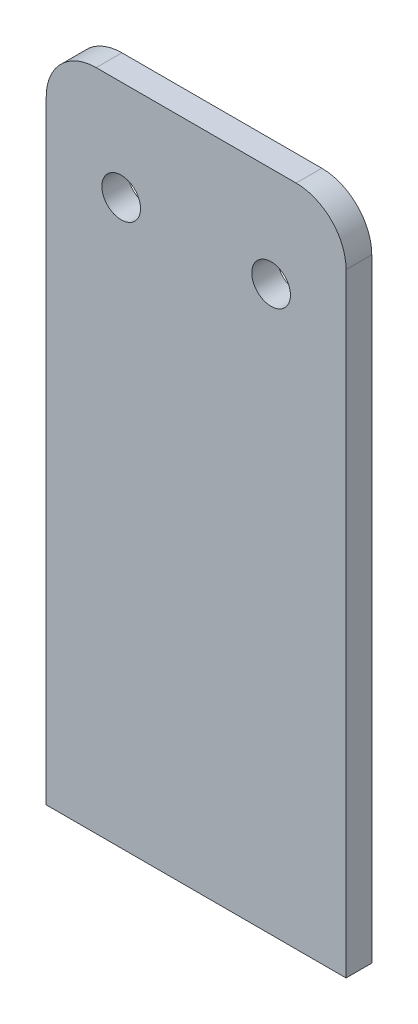
ISO-10303-21;
HEADER;
FILE_DESCRIPTION(('STEP AP214'),'2;1');
FILE_NAME('part.step','',(''),(''),'','','');
FILE_SCHEMA(('AUTOMOTIVE_DESIGN { 1 0 10303 214 1 1 1 1 }'));
ENDSEC;
DATA;
#1=APPLICATION_CONTEXT('core data for automotive mechanical design processes');
#2=APPLICATION_PROTOCOL_DEFINITION('international standard','automotive_design',2000,#1);
#3=PRODUCT_CONTEXT('',#1,'mechanical');
#4=PRODUCT('Part','Part','',(#3));
#5=PRODUCT_RELATED_PRODUCT_CATEGORY('part','',(#4));
#6=PRODUCT_DEFINITION_FORMATION('','',#4);
#7=PRODUCT_DEFINITION_CONTEXT('part definition',#1,'design');
#8=PRODUCT_DEFINITION('design','',#6,#7);
#9=PRODUCT_DEFINITION_SHAPE('','',#8);
#10=(LENGTH_UNIT() NAMED_UNIT(*) SI_UNIT(.MILLI.,.METRE.));
#11=(NAMED_UNIT(*) PLANE_ANGLE_UNIT() SI_UNIT($,.RADIAN.));
#12=(NAMED_UNIT(*) SI_UNIT($,.STERADIAN.) SOLID_ANGLE_UNIT());
#13=UNCERTAINTY_MEASURE_WITH_UNIT(LENGTH_MEASURE(1.E-05),#10,'distance_accuracy_value','');
#14=(GEOMETRIC_REPRESENTATION_CONTEXT(3) GLOBAL_UNCERTAINTY_ASSIGNED_CONTEXT((#13)) GLOBAL_UNIT_ASSIGNED_CONTEXT((#10,
#11,#12)) REPRESENTATION_CONTEXT('',''));
#15=CARTESIAN_POINT('',(0.,0.,0.));
#16=DIRECTION('',(0.,0.,1.));
#17=DIRECTION('',(1.,0.,0.));
#18=AXIS2_PLACEMENT_3D('',#15,#16,#17);
#19=CARTESIAN_POINT('',(19.05,-42.154475,-3.2639));
#20=DIRECTION('',(1.,0.,0.));
#21=DIRECTION('',(0.,0.,-1.));
#22=AXIS2_PLACEMENT_3D('',#19,#20,#21);
#23=PLANE('',#22);
#24=DIRECTION('',(0.,1.,0.));
#25=VECTOR('',#24,1.);
#26=CARTESIAN_POINT('',(19.05,-42.154475,-3.2639));
#27=LINE('',#26,#25);
#28=CARTESIAN_POINT('',(19.05,-42.154475,-3.2639));
#29=VERTEX_POINT('',#28);
#30=CARTESIAN_POINT('',(19.05,35.804475,-3.2639));
#31=VERTEX_POINT('',#30);
#32=EDGE_CURVE('E111',#29,#31,#27,.T.);
#33=ORIENTED_EDGE('',*,*,#32,.T.);
#34=DIRECTION('',(0.,0.,1.));
#35=VECTOR('',#34,1.);
#36=CARTESIAN_POINT('',(19.05,35.804475,-3.2639));
#37=LINE('',#36,#35);
#38=CARTESIAN_POINT('',(19.05,35.804475,0.));
#39=VERTEX_POINT('',#38);
#40=EDGE_CURVE('E11',#31,#39,#37,.T.);
#41=ORIENTED_EDGE('',*,*,#40,.T.);
#42=DIRECTION('',(0.,1.,0.));
#43=VECTOR('',#42,1.);
#44=CARTESIAN_POINT('',(19.05,-42.154475,0.));
#45=LINE('',#44,#43);
#46=CARTESIAN_POINT('',(19.05,-42.154475,0.));
#47=VERTEX_POINT('',#46);
#48=EDGE_CURVE('E115',#47,#39,#45,.T.);
#49=ORIENTED_EDGE('',*,*,#48,.F.);
#50=DIRECTION('',(0.,0.,1.));
#51=VECTOR('',#50,1.);
#52=CARTESIAN_POINT('',(19.05,-42.154475,-3.2639));
#53=LINE('',#52,#51);
#54=EDGE_CURVE('E108',#29,#47,#53,.T.);
#55=ORIENTED_EDGE('',*,*,#54,.F.);
#56=EDGE_LOOP('',(#33,#41,#49,#55));
#57=FACE_BOUND('',#56,.T.);
#58=ADVANCED_FACE('F39',(#57),#23,.T.);
#59=CARTESIAN_POINT('',(-19.05,-42.154475,-3.2639));
#60=DIRECTION('',(0.,-1.,0.));
#61=DIRECTION('',(0.,0.,-1.));
#62=AXIS2_PLACEMENT_3D('',#59,#60,#61);
#63=PLANE('',#62);
#64=DIRECTION('',(1.,0.,0.));
#65=VECTOR('',#64,1.);
#66=CARTESIAN_POINT('',(-19.05,-42.154475,0.));
#67=LINE('',#66,#65);
#68=CARTESIAN_POINT('',(-19.05,-42.154475,0.));
#69=VERTEX_POINT('',#68);
#70=EDGE_CURVE('E107',#69,#47,#67,.T.);
#71=ORIENTED_EDGE('',*,*,#70,.F.);
#72=DIRECTION('',(0.,0.,1.));
#73=VECTOR('',#72,1.);
#74=CARTESIAN_POINT('',(-19.05,-42.154475,-3.2639));
#75=LINE('',#74,#73);
#76=CARTESIAN_POINT('',(-19.05,-42.154475,-3.2639));
#77=VERTEX_POINT('',#76);
#78=EDGE_CURVE('E96',#77,#69,#75,.T.);
#79=ORIENTED_EDGE('',*,*,#78,.F.);
#80=DIRECTION('',(1.,0.,0.));
#81=VECTOR('',#80,1.);
#82=CARTESIAN_POINT('',(-19.05,-42.154475,-3.2639));
#83=LINE('',#82,#81);
#84=EDGE_CURVE('E100',#77,#29,#83,.T.);
#85=ORIENTED_EDGE('',*,*,#84,.T.);
#86=ORIENTED_EDGE('',*,*,#54,.T.);
#87=EDGE_LOOP('',(#71,#79,#85,#86));
#88=FACE_BOUND('',#87,.T.);
#89=ADVANCED_FACE('F105',(#88),#63,.T.);
#90=CARTESIAN_POINT('',(-19.05,-42.154475,-3.2639));
#91=DIRECTION('',(-1.,0.,0.));
#92=DIRECTION('',(0.,0.,1.));
#93=AXIS2_PLACEMENT_3D('',#90,#91,#92);
#94=PLANE('',#93);
#95=DIRECTION('',(0.,-1.,0.));
#96=VECTOR('',#95,1.);
#97=CARTESIAN_POINT('',(-19.05,-42.154475,0.));
#98=LINE('',#97,#96);
#99=CARTESIAN_POINT('',(-19.05,35.804475,0.));
#100=VERTEX_POINT('',#99);
#101=EDGE_CURVE('E122',#100,#69,#98,.T.);
#102=ORIENTED_EDGE('',*,*,#101,.F.);
#103=DIRECTION('',(0.,0.,1.));
#104=VECTOR('',#103,1.);
#105=CARTESIAN_POINT('',(-19.05,35.804475,-3.2639));
#106=LINE('',#105,#104);
#107=CARTESIAN_POINT('',(-19.05,35.804475,-3.2639));
#108=VERTEX_POINT('',#107);
#109=EDGE_CURVE('E62',#100,#108,#106,.F.);
#110=ORIENTED_EDGE('',*,*,#109,.T.);
#111=DIRECTION('',(0.,-1.,0.));
#112=VECTOR('',#111,1.);
#113=CARTESIAN_POINT('',(-19.05,-42.154475,-3.2639));
#114=LINE('',#113,#112);
#115=EDGE_CURVE('E93',#108,#77,#114,.T.);
#116=ORIENTED_EDGE('',*,*,#115,.T.);
#117=ORIENTED_EDGE('',*,*,#78,.T.);
#118=EDGE_LOOP('',(#102,#110,#116,#117));
#119=FACE_BOUND('',#118,.T.);
#120=ADVANCED_FACE('F95',(#119),#94,.T.);
#121=CARTESIAN_POINT('',(-19.05,42.154475,-3.2639));
#122=DIRECTION('',(0.,1.,0.));
#123=DIRECTION('',(0.,0.,1.));
#124=AXIS2_PLACEMENT_3D('',#121,#122,#123);
#125=PLANE('',#124);
#126=DIRECTION('',(-1.,0.,0.));
#127=VECTOR('',#126,1.);
#128=CARTESIAN_POINT('',(-19.05,42.154475,-3.2639));
#129=LINE('',#128,#127);
#130=CARTESIAN_POINT('',(12.7,42.154475,-3.2639));
#131=VERTEX_POINT('',#130);
#132=CARTESIAN_POINT('',(-12.7,42.154475,-3.2639));
#133=VERTEX_POINT('',#132);
#134=EDGE_CURVE('E101',#131,#133,#129,.T.);
#135=ORIENTED_EDGE('',*,*,#134,.T.);
#136=DIRECTION('',(0.,0.,1.));
#137=VECTOR('',#136,1.);
#138=CARTESIAN_POINT('',(-12.7,42.154475,-3.2639));
#139=LINE('',#138,#137);
#140=CARTESIAN_POINT('',(-12.7,42.154475,0.));
#141=VERTEX_POINT('',#140);
#142=EDGE_CURVE('E128',#133,#141,#139,.T.);
#143=ORIENTED_EDGE('',*,*,#142,.T.);
#144=DIRECTION('',(-1.,0.,0.));
#145=VECTOR('',#144,1.);
#146=CARTESIAN_POINT('',(-19.05,42.154475,0.));
#147=LINE('',#146,#145);
#148=CARTESIAN_POINT('',(12.7,42.154475,0.));
#149=VERTEX_POINT('',#148);
#150=EDGE_CURVE('E118',#149,#141,#147,.T.);
#151=ORIENTED_EDGE('',*,*,#150,.F.);
#152=DIRECTION('',(0.,0.,1.));
#153=VECTOR('',#152,1.);
#154=CARTESIAN_POINT('',(12.7,42.154475,-3.2639));
#155=LINE('',#154,#153);
#156=EDGE_CURVE('E125',#149,#131,#155,.F.);
#157=ORIENTED_EDGE('',*,*,#156,.T.);
#158=EDGE_LOOP('',(#135,#143,#151,#157));
#159=FACE_BOUND('',#158,.T.);
#160=ADVANCED_FACE('F140',(#159),#125,.T.);
#161=CARTESIAN_POINT('',(0.,0.,-3.2639));
#162=DIRECTION('',(0.,0.,-1.));
#163=DIRECTION('',(-1.,0.,0.));
#164=AXIS2_PLACEMENT_3D('',#161,#162,#163);
#165=PLANE('',#164);
#166=CARTESIAN_POINT('',(-9.525,29.454475,-3.2639));
#167=DIRECTION('',(0.,0.,1.));
#168=DIRECTION('',(1.,0.,0.));
#169=AXIS2_PLACEMENT_3D('',#166,#167,#168);
#170=CIRCLE('',#169,2.45745);
#171=CARTESIAN_POINT('',(-7.06755,29.454475,-3.2639));
#172=VERTEX_POINT('',#171);
#173=EDGE_CURVE('E157',#172,#172,#170,.T.);
#174=ORIENTED_EDGE('',*,*,#173,.T.);
#175=EDGE_LOOP('',(#174));
#176=FACE_BOUND('',#175,.T.);
#177=CARTESIAN_POINT('',(9.525,29.454475,-3.2639));
#178=DIRECTION('',(0.,0.,1.));
#179=DIRECTION('',(1.,0.,0.));
#180=AXIS2_PLACEMENT_3D('',#177,#178,#179);
#181=CIRCLE('',#180,2.45745);
#182=CARTESIAN_POINT('',(11.98245,29.454475,-3.2639));
#183=VERTEX_POINT('',#182);
#184=EDGE_CURVE('E119',#183,#183,#181,.T.);
#185=ORIENTED_EDGE('',*,*,#184,.T.);
#186=EDGE_LOOP('',(#185));
#187=FACE_BOUND('',#186,.T.);
#188=ORIENTED_EDGE('',*,*,#115,.F.);
#189=CARTESIAN_POINT('',(-12.7,35.804475,-3.2639));
#190=DIRECTION('',(0.,0.,-1.));
#191=DIRECTION('',(-1.,0.,0.));
#192=AXIS2_PLACEMENT_3D('',#189,#190,#191);
#193=CIRCLE('',#192,6.35);
#194=EDGE_CURVE('E47',#108,#133,#193,.T.);
#195=ORIENTED_EDGE('',*,*,#194,.T.);
#196=ORIENTED_EDGE('',*,*,#134,.F.);
#197=CARTESIAN_POINT('',(12.7,35.804475,-3.2639));
#198=DIRECTION('',(0.,0.,-1.));
#199=DIRECTION('',(-1.,0.,0.));
#200=AXIS2_PLACEMENT_3D('',#197,#198,#199);
#201=CIRCLE('',#200,6.35);
#202=EDGE_CURVE('E54',#131,#31,#201,.T.);
#203=ORIENTED_EDGE('',*,*,#202,.T.);
#204=ORIENTED_EDGE('',*,*,#32,.F.);
#205=ORIENTED_EDGE('',*,*,#84,.F.);
#206=EDGE_LOOP('',(#188,#195,#196,#203,#204,#205));
#207=FACE_BOUND('',#206,.T.);
#208=ADVANCED_FACE('F110',(#176,#187,#207),#165,.T.);
#209=CARTESIAN_POINT('',(0.,0.,0.));
#210=DIRECTION('',(0.,0.,-1.));
#211=DIRECTION('',(-1.,0.,0.));
#212=AXIS2_PLACEMENT_3D('',#209,#210,#211);
#213=PLANE('',#212);
#214=CARTESIAN_POINT('',(-9.525,29.454475,0.));
#215=DIRECTION('',(0.,0.,1.));
#216=DIRECTION('',(1.,0.,0.));
#217=AXIS2_PLACEMENT_3D('',#214,#215,#216);
#218=CIRCLE('',#217,2.45745);
#219=CARTESIAN_POINT('',(-7.06755,29.454475,0.));
#220=VERTEX_POINT('',#219);
#221=EDGE_CURVE('E160',#220,#220,#218,.T.);
#222=ORIENTED_EDGE('',*,*,#221,.F.);
#223=EDGE_LOOP('',(#222));
#224=FACE_BOUND('',#223,.T.);
#225=CARTESIAN_POINT('',(9.525,29.454475,0.));
#226=DIRECTION('',(0.,0.,1.));
#227=DIRECTION('',(1.,0.,0.));
#228=AXIS2_PLACEMENT_3D('',#225,#226,#227);
#229=CIRCLE('',#228,2.45745);
#230=CARTESIAN_POINT('',(11.98245,29.454475,0.));
#231=VERTEX_POINT('',#230);
#232=EDGE_CURVE('E154',#231,#231,#229,.T.);
#233=ORIENTED_EDGE('',*,*,#232,.F.);
#234=EDGE_LOOP('',(#233));
#235=FACE_BOUND('',#234,.T.);
#236=ORIENTED_EDGE('',*,*,#150,.T.);
#237=CARTESIAN_POINT('',(-12.7,35.804475,0.));
#238=DIRECTION('',(0.,0.,-1.));
#239=DIRECTION('',(-1.,0.,0.));
#240=AXIS2_PLACEMENT_3D('',#237,#238,#239);
#241=CIRCLE('',#240,6.35);
#242=EDGE_CURVE('E133',#141,#100,#241,.F.);
#243=ORIENTED_EDGE('',*,*,#242,.T.);
#244=ORIENTED_EDGE('',*,*,#101,.T.);
#245=ORIENTED_EDGE('',*,*,#70,.T.);
#246=ORIENTED_EDGE('',*,*,#48,.T.);
#247=CARTESIAN_POINT('',(12.7,35.804475,0.));
#248=DIRECTION('',(0.,0.,-1.));
#249=DIRECTION('',(-1.,0.,0.));
#250=AXIS2_PLACEMENT_3D('',#247,#248,#249);
#251=CIRCLE('',#250,6.35);
#252=EDGE_CURVE('E131',#39,#149,#251,.F.);
#253=ORIENTED_EDGE('',*,*,#252,.T.);
#254=EDGE_LOOP('',(#236,#243,#244,#245,#246,#253));
#255=FACE_BOUND('',#254,.T.);
#256=ADVANCED_FACE('F145',(#224,#235,#255),#213,.F.);
#257=CARTESIAN_POINT('',(9.525,29.454475,0.));
#258=DIRECTION('',(0.,0.,1.));
#259=DIRECTION('',(1.,0.,0.));
#260=AXIS2_PLACEMENT_3D('',#257,#258,#259);
#261=CYLINDRICAL_SURFACE('',#260,2.45745);
#262=ORIENTED_EDGE('',*,*,#184,.F.);
#263=EDGE_LOOP('',(#262));
#264=FACE_BOUND('',#263,.T.);
#265=ORIENTED_EDGE('',*,*,#232,.T.);
#266=EDGE_LOOP('',(#265));
#267=FACE_BOUND('',#266,.T.);
#268=ADVANCED_FACE('F168',(#264,#267),#261,.F.);
#269=CARTESIAN_POINT('',(-9.525,29.454475,0.));
#270=DIRECTION('',(0.,0.,1.));
#271=DIRECTION('',(1.,0.,0.));
#272=AXIS2_PLACEMENT_3D('',#269,#270,#271);
#273=CYLINDRICAL_SURFACE('',#272,2.45745);
#274=ORIENTED_EDGE('',*,*,#173,.F.);
#275=EDGE_LOOP('',(#274));
#276=FACE_BOUND('',#275,.T.);
#277=ORIENTED_EDGE('',*,*,#221,.T.);
#278=EDGE_LOOP('',(#277));
#279=FACE_BOUND('',#278,.T.);
#280=ADVANCED_FACE('F164',(#276,#279),#273,.F.);
#281=CARTESIAN_POINT('',(-12.7,35.804475,-3.2639));
#282=DIRECTION('',(0.,0.,1.));
#283=DIRECTION('',(1.,0.,0.));
#284=AXIS2_PLACEMENT_3D('',#281,#282,#283);
#285=CYLINDRICAL_SURFACE('',#284,6.35);
#286=ORIENTED_EDGE('',*,*,#194,.F.);
#287=ORIENTED_EDGE('',*,*,#109,.F.);
#288=ORIENTED_EDGE('',*,*,#242,.F.);
#289=ORIENTED_EDGE('',*,*,#142,.F.);
#290=EDGE_LOOP('',(#286,#287,#288,#289));
#291=FACE_BOUND('',#290,.T.);
#292=ADVANCED_FACE('F143',(#291),#285,.T.);
#293=CARTESIAN_POINT('',(12.7,35.804475,-3.2639));
#294=DIRECTION('',(0.,0.,1.));
#295=DIRECTION('',(1.,0.,0.));
#296=AXIS2_PLACEMENT_3D('',#293,#294,#295);
#297=CYLINDRICAL_SURFACE('',#296,6.35);
#298=ORIENTED_EDGE('',*,*,#202,.F.);
#299=ORIENTED_EDGE('',*,*,#156,.F.);
#300=ORIENTED_EDGE('',*,*,#252,.F.);
#301=ORIENTED_EDGE('',*,*,#40,.F.);
#302=EDGE_LOOP('',(#298,#299,#300,#301));
#303=FACE_BOUND('',#302,.T.);
#304=ADVANCED_FACE('F41',(#303),#297,.T.);
#305=CLOSED_SHELL('',(#58,#89,#120,#160,#208,#256,#268,#280,#292,#304));
#306=MANIFOLD_SOLID_BREP('B2',#305);
#307=ADVANCED_BREP_SHAPE_REPRESENTATION('',(#18,#306),#14);
#308=SHAPE_DEFINITION_REPRESENTATION(#9,#307);
ENDSEC;
END-ISO-10303-21;
